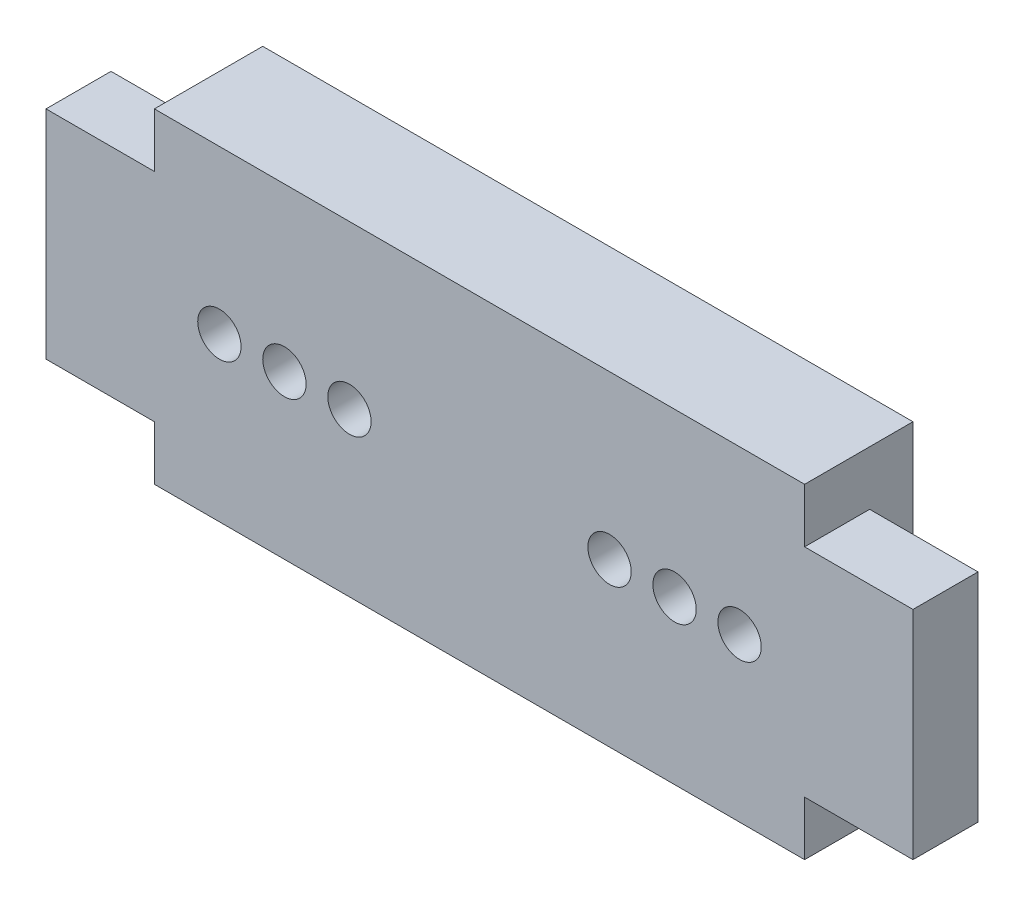
ISO-10303-21;
HEADER;
FILE_DESCRIPTION(('STEP AP214'),'2;1');
FILE_NAME('part.step','',(''),(''),'','','');
FILE_SCHEMA(('AUTOMOTIVE_DESIGN { 1 0 10303 214 1 1 1 1 }'));
ENDSEC;
DATA;
#1=APPLICATION_CONTEXT('core data for automotive mechanical design processes');
#2=APPLICATION_PROTOCOL_DEFINITION('international standard','automotive_design',2000,#1);
#3=PRODUCT_CONTEXT('',#1,'mechanical');
#4=PRODUCT('Part','Part','',(#3));
#5=PRODUCT_RELATED_PRODUCT_CATEGORY('part','',(#4));
#6=PRODUCT_DEFINITION_FORMATION('','',#4);
#7=PRODUCT_DEFINITION_CONTEXT('part definition',#1,'design');
#8=PRODUCT_DEFINITION('design','',#6,#7);
#9=PRODUCT_DEFINITION_SHAPE('','',#8);
#10=(LENGTH_UNIT() NAMED_UNIT(*) SI_UNIT(.MILLI.,.METRE.));
#11=(NAMED_UNIT(*) PLANE_ANGLE_UNIT() SI_UNIT($,.RADIAN.));
#12=(NAMED_UNIT(*) SI_UNIT($,.STERADIAN.) SOLID_ANGLE_UNIT());
#13=UNCERTAINTY_MEASURE_WITH_UNIT(LENGTH_MEASURE(1.E-05),#10,'distance_accuracy_value','');
#14=(GEOMETRIC_REPRESENTATION_CONTEXT(3) GLOBAL_UNCERTAINTY_ASSIGNED_CONTEXT((#13)) GLOBAL_UNIT_ASSIGNED_CONTEXT((#10,
#11,#12)) REPRESENTATION_CONTEXT('',''));
#15=CARTESIAN_POINT('',(0.,0.,0.));
#16=DIRECTION('',(0.,0.,1.));
#17=DIRECTION('',(1.,0.,0.));
#18=AXIS2_PLACEMENT_3D('',#15,#16,#17);
#19=CARTESIAN_POINT('',(-26.8805369127517,15.,0.));
#20=DIRECTION('',(1.,0.,0.));
#21=DIRECTION('',(0.,0.,-1.));
#22=AXIS2_PLACEMENT_3D('',#19,#20,#21);
#23=PLANE('',#22);
#24=DIRECTION('',(0.,0.,1.));
#25=VECTOR('',#24,1.);
#26=CARTESIAN_POINT('',(-26.8805369127517,12.5,-26.7902684563758));
#27=LINE('',#26,#25);
#28=CARTESIAN_POINT('',(-26.8805369127517,12.5,-26.7902684563758));
#29=VERTEX_POINT('',#28);
#30=CARTESIAN_POINT('',(-26.8805369127517,12.5,-23.7902684563758));
#31=VERTEX_POINT('',#30);
#32=EDGE_CURVE('E128',#29,#31,#27,.T.);
#33=ORIENTED_EDGE('',*,*,#32,.F.);
#34=DIRECTION('',(0.,-1.,0.));
#35=VECTOR('',#34,1.);
#36=CARTESIAN_POINT('',(-26.8805369127517,12.5,-26.7902684563758));
#37=LINE('',#36,#35);
#38=CARTESIAN_POINT('',(-26.8805369127517,2.5,-26.7902684563758));
#39=VERTEX_POINT('',#38);
#40=EDGE_CURVE('E153',#29,#39,#37,.T.);
#41=ORIENTED_EDGE('',*,*,#40,.T.);
#42=DIRECTION('',(0.,0.,1.));
#43=VECTOR('',#42,1.);
#44=CARTESIAN_POINT('',(-26.8805369127517,2.5,-26.7902684563758));
#45=LINE('',#44,#43);
#46=CARTESIAN_POINT('',(-26.8805369127517,2.5,-23.7902684563758));
#47=VERTEX_POINT('',#46);
#48=EDGE_CURVE('E314',#39,#47,#45,.T.);
#49=ORIENTED_EDGE('',*,*,#48,.T.);
#50=DIRECTION('',(0.,-1.,0.));
#51=VECTOR('',#50,1.);
#52=CARTESIAN_POINT('',(-26.8805369127517,15.,-23.7902684563758));
#53=LINE('',#52,#51);
#54=CARTESIAN_POINT('',(-26.8805369127517,0.,-23.7902684563758));
#55=VERTEX_POINT('',#54);
#56=EDGE_CURVE('E159',#47,#55,#53,.T.);
#57=ORIENTED_EDGE('',*,*,#56,.T.);
#58=DIRECTION('',(0.,0.,1.));
#59=VECTOR('',#58,1.);
#60=CARTESIAN_POINT('',(-26.8805369127517,0.,0.));
#61=LINE('',#60,#59);
#62=CARTESIAN_POINT('',(-26.8805369127517,0.,-28.7902684563758));
#63=VERTEX_POINT('',#62);
#64=EDGE_CURVE('E193',#63,#55,#61,.T.);
#65=ORIENTED_EDGE('',*,*,#64,.F.);
#66=DIRECTION('',(0.,-1.,0.));
#67=VECTOR('',#66,1.);
#68=CARTESIAN_POINT('',(-26.8805369127517,15.,-28.7902684563758));
#69=LINE('',#68,#67);
#70=CARTESIAN_POINT('',(-26.8805369127517,15.,-28.7902684563758));
#71=VERTEX_POINT('',#70);
#72=EDGE_CURVE('E11',#71,#63,#69,.T.);
#73=ORIENTED_EDGE('',*,*,#72,.F.);
#74=DIRECTION('',(0.,0.,1.));
#75=VECTOR('',#74,1.);
#76=CARTESIAN_POINT('',(-26.8805369127517,15.,0.));
#77=LINE('',#76,#75);
#78=CARTESIAN_POINT('',(-26.8805369127517,15.,-23.7902684563758));
#79=VERTEX_POINT('',#78);
#80=EDGE_CURVE('E156',#71,#79,#77,.T.);
#81=ORIENTED_EDGE('',*,*,#80,.T.);
#82=EDGE_CURVE('E148',#79,#31,#53,.T.);
#83=ORIENTED_EDGE('',*,*,#82,.T.);
#84=EDGE_LOOP('',(#33,#41,#49,#57,#65,#73,#81,#83));
#85=FACE_BOUND('',#84,.T.);
#86=ADVANCED_FACE('F41',(#85),#23,.T.);
#87=CARTESIAN_POINT('',(0.,15.,-28.7902684563758));
#88=DIRECTION('',(0.,0.,-1.));
#89=DIRECTION('',(-1.,0.,0.));
#90=AXIS2_PLACEMENT_3D('',#87,#88,#89);
#91=PLANE('',#90);
#92=CARTESIAN_POINT('',(-41.8805369127517,7.5,-28.7902684563758));
#93=DIRECTION('',(0.,0.,-1.));
#94=DIRECTION('',(-1.,0.,0.));
#95=AXIS2_PLACEMENT_3D('',#92,#93,#94);
#96=CIRCLE('',#95,2.);
#97=CARTESIAN_POINT('',(-43.8805369127517,7.5,-28.7902684563758));
#98=VERTEX_POINT('',#97);
#99=EDGE_CURVE('E260',#98,#98,#96,.T.);
#100=ORIENTED_EDGE('',*,*,#99,.F.);
#101=EDGE_LOOP('',(#100));
#102=FACE_BOUND('',#101,.T.);
#103=CARTESIAN_POINT('',(-32.8805369127517,7.5,-28.7902684563758));
#104=DIRECTION('',(0.,0.,-1.));
#105=DIRECTION('',(-1.,0.,0.));
#106=AXIS2_PLACEMENT_3D('',#103,#104,#105);
#107=CIRCLE('',#106,0.999999999999998);
#108=CARTESIAN_POINT('',(-33.8805369127517,7.5,-28.7902684563758));
#109=VERTEX_POINT('',#108);
#110=EDGE_CURVE('E242',#109,#109,#107,.T.);
#111=ORIENTED_EDGE('',*,*,#110,.F.);
#112=EDGE_LOOP('',(#111));
#113=FACE_BOUND('',#112,.T.);
#114=CARTESIAN_POINT('',(-29.8805369127517,7.5,-28.7902684563758));
#115=DIRECTION('',(0.,0.,-1.));
#116=DIRECTION('',(-1.,0.,0.));
#117=AXIS2_PLACEMENT_3D('',#114,#115,#116);
#118=CIRCLE('',#117,1.);
#119=CARTESIAN_POINT('',(-30.8805369127517,7.5,-28.7902684563758));
#120=VERTEX_POINT('',#119);
#121=EDGE_CURVE('E234',#120,#120,#118,.T.);
#122=ORIENTED_EDGE('',*,*,#121,.F.);
#123=EDGE_LOOP('',(#122));
#124=FACE_BOUND('',#123,.T.);
#125=CARTESIAN_POINT('',(-53.8805369127517,7.5,-28.7902684563758));
#126=DIRECTION('',(0.,0.,-1.));
#127=DIRECTION('',(1.,0.,0.));
#128=AXIS2_PLACEMENT_3D('',#125,#126,#127);
#129=CIRCLE('',#128,0.999999999999998);
#130=CARTESIAN_POINT('',(-52.8805369127517,7.5,-28.7902684563758));
#131=VERTEX_POINT('',#130);
#132=EDGE_CURVE('E224',#131,#131,#129,.T.);
#133=ORIENTED_EDGE('',*,*,#132,.F.);
#134=EDGE_LOOP('',(#133));
#135=FACE_BOUND('',#134,.T.);
#136=CARTESIAN_POINT('',(-50.8805369127517,7.5,-28.7902684563758));
#137=DIRECTION('',(0.,0.,-1.));
#138=DIRECTION('',(1.,0.,0.));
#139=AXIS2_PLACEMENT_3D('',#136,#137,#138);
#140=CIRCLE('',#139,0.999999999999998);
#141=CARTESIAN_POINT('',(-49.8805369127517,7.5,-28.7902684563758));
#142=VERTEX_POINT('',#141);
#143=EDGE_CURVE('E225',#142,#142,#140,.T.);
#144=ORIENTED_EDGE('',*,*,#143,.F.);
#145=EDGE_LOOP('',(#144));
#146=FACE_BOUND('',#145,.T.);
#147=CARTESIAN_POINT('',(-47.8805369127517,7.5,-28.7902684563758));
#148=DIRECTION('',(0.,0.,-1.));
#149=DIRECTION('',(1.,0.,0.));
#150=AXIS2_PLACEMENT_3D('',#147,#148,#149);
#151=CIRCLE('',#150,0.999999999999998);
#152=CARTESIAN_POINT('',(-46.8805369127517,7.5,-28.7902684563758));
#153=VERTEX_POINT('',#152);
#154=EDGE_CURVE('E255',#153,#153,#151,.T.);
#155=ORIENTED_EDGE('',*,*,#154,.F.);
#156=EDGE_LOOP('',(#155));
#157=FACE_BOUND('',#156,.T.);
#158=CARTESIAN_POINT('',(-35.8805369127517,7.5,-28.7902684563758));
#159=DIRECTION('',(0.,0.,-1.));
#160=DIRECTION('',(-1.,0.,0.));
#161=AXIS2_PLACEMENT_3D('',#158,#159,#160);
#162=CIRCLE('',#161,0.999999999999998);
#163=CARTESIAN_POINT('',(-36.8805369127517,7.5,-28.7902684563758));
#164=VERTEX_POINT('',#163);
#165=EDGE_CURVE('E215',#164,#164,#162,.T.);
#166=ORIENTED_EDGE('',*,*,#165,.F.);
#167=EDGE_LOOP('',(#166));
#168=FACE_BOUND('',#167,.T.);
#169=DIRECTION('',(1.,0.,0.));
#170=VECTOR('',#169,1.);
#171=CARTESIAN_POINT('',(0.,0.,-28.7902684563758));
#172=LINE('',#171,#170);
#173=CARTESIAN_POINT('',(-56.8805369127517,0.,-28.7902684563758));
#174=VERTEX_POINT('',#173);
#175=EDGE_CURVE('E187',#174,#63,#172,.T.);
#176=ORIENTED_EDGE('',*,*,#175,.F.);
#177=DIRECTION('',(0.,-1.,0.));
#178=VECTOR('',#177,1.);
#179=CARTESIAN_POINT('',(-56.8805369127517,15.,-28.7902684563758));
#180=LINE('',#179,#178);
#181=CARTESIAN_POINT('',(-56.8805369127517,15.,-28.7902684563758));
#182=VERTEX_POINT('',#181);
#183=EDGE_CURVE('E49',#182,#174,#180,.T.);
#184=ORIENTED_EDGE('',*,*,#183,.F.);
#185=DIRECTION('',(1.,0.,0.));
#186=VECTOR('',#185,1.);
#187=CARTESIAN_POINT('',(0.,15.,-28.7902684563758));
#188=LINE('',#187,#186);
#189=EDGE_CURVE('E207',#182,#71,#188,.T.);
#190=ORIENTED_EDGE('',*,*,#189,.T.);
#191=ORIENTED_EDGE('',*,*,#72,.T.);
#192=EDGE_LOOP('',(#176,#184,#190,#191));
#193=FACE_BOUND('',#192,.T.);
#194=ADVANCED_FACE('F188',(#102,#113,#124,#135,#146,#157,#168,#193),#91,.T.);
#195=CARTESIAN_POINT('',(-56.8805369127517,15.,0.));
#196=DIRECTION('',(-1.,0.,0.));
#197=DIRECTION('',(0.,0.,1.));
#198=AXIS2_PLACEMENT_3D('',#195,#196,#197);
#199=PLANE('',#198);
#200=DIRECTION('',(0.,0.,1.));
#201=VECTOR('',#200,1.);
#202=CARTESIAN_POINT('',(-56.8805369127517,2.5,-26.7902684563758));
#203=LINE('',#202,#201);
#204=CARTESIAN_POINT('',(-56.8805369127517,2.5,-26.7902684563758));
#205=VERTEX_POINT('',#204);
#206=CARTESIAN_POINT('',(-56.8805369127517,2.5,-23.7902684563758));
#207=VERTEX_POINT('',#206);
#208=EDGE_CURVE('E276',#205,#207,#203,.T.);
#209=ORIENTED_EDGE('',*,*,#208,.F.);
#210=DIRECTION('',(0.,-1.,0.));
#211=VECTOR('',#210,1.);
#212=CARTESIAN_POINT('',(-56.8805369127517,12.5,-26.7902684563758));
#213=LINE('',#212,#211);
#214=CARTESIAN_POINT('',(-56.8805369127517,12.5,-26.7902684563758));
#215=VERTEX_POINT('',#214);
#216=EDGE_CURVE('E279',#215,#205,#213,.T.);
#217=ORIENTED_EDGE('',*,*,#216,.F.);
#218=DIRECTION('',(0.,0.,1.));
#219=VECTOR('',#218,1.);
#220=CARTESIAN_POINT('',(-56.8805369127517,12.5,-26.7902684563758));
#221=LINE('',#220,#219);
#222=CARTESIAN_POINT('',(-56.8805369127517,12.5,-23.7902684563758));
#223=VERTEX_POINT('',#222);
#224=EDGE_CURVE('E273',#215,#223,#221,.T.);
#225=ORIENTED_EDGE('',*,*,#224,.T.);
#226=DIRECTION('',(0.,-1.,0.));
#227=VECTOR('',#226,1.);
#228=CARTESIAN_POINT('',(-56.8805369127517,15.,-23.7902684563758));
#229=LINE('',#228,#227);
#230=CARTESIAN_POINT('',(-56.8805369127517,15.,-23.7902684563758));
#231=VERTEX_POINT('',#230);
#232=EDGE_CURVE('E163',#231,#223,#229,.T.);
#233=ORIENTED_EDGE('',*,*,#232,.F.);
#234=DIRECTION('',(0.,0.,-1.));
#235=VECTOR('',#234,1.);
#236=CARTESIAN_POINT('',(-56.8805369127517,15.,0.));
#237=LINE('',#236,#235);
#238=EDGE_CURVE('E182',#231,#182,#237,.T.);
#239=ORIENTED_EDGE('',*,*,#238,.T.);
#240=ORIENTED_EDGE('',*,*,#183,.T.);
#241=DIRECTION('',(0.,0.,-1.));
#242=VECTOR('',#241,1.);
#243=CARTESIAN_POINT('',(-56.8805369127517,0.,0.));
#244=LINE('',#243,#242);
#245=CARTESIAN_POINT('',(-56.8805369127517,0.,-23.7902684563758));
#246=VERTEX_POINT('',#245);
#247=EDGE_CURVE('E180',#246,#174,#244,.T.);
#248=ORIENTED_EDGE('',*,*,#247,.F.);
#249=EDGE_CURVE('E158',#207,#246,#229,.T.);
#250=ORIENTED_EDGE('',*,*,#249,.F.);
#251=EDGE_LOOP('',(#209,#217,#225,#233,#239,#240,#248,#250));
#252=FACE_BOUND('',#251,.T.);
#253=ADVANCED_FACE('F177',(#252),#199,.T.);
#254=CARTESIAN_POINT('',(0.,15.,-23.7902684563758));
#255=DIRECTION('',(0.,0.,-1.));
#256=DIRECTION('',(-1.,0.,0.));
#257=AXIS2_PLACEMENT_3D('',#254,#255,#256);
#258=PLANE('',#257);
#259=CARTESIAN_POINT('',(-32.8805369127517,7.5,-23.7902684563758));
#260=DIRECTION('',(0.,0.,-1.));
#261=DIRECTION('',(-1.,0.,0.));
#262=AXIS2_PLACEMENT_3D('',#259,#260,#261);
#263=CIRCLE('',#262,0.999999999999998);
#264=CARTESIAN_POINT('',(-33.8805369127517,7.5,-23.7902684563758));
#265=VERTEX_POINT('',#264);
#266=EDGE_CURVE('E219',#265,#265,#263,.F.);
#267=ORIENTED_EDGE('',*,*,#266,.F.);
#268=EDGE_LOOP('',(#267));
#269=FACE_BOUND('',#268,.T.);
#270=CARTESIAN_POINT('',(-29.8805369127517,7.5,-23.7902684563758));
#271=DIRECTION('',(0.,0.,-1.));
#272=DIRECTION('',(-1.,0.,0.));
#273=AXIS2_PLACEMENT_3D('',#270,#271,#272);
#274=CIRCLE('',#273,1.);
#275=CARTESIAN_POINT('',(-30.8805369127517,7.5,-23.7902684563758));
#276=VERTEX_POINT('',#275);
#277=EDGE_CURVE('E238',#276,#276,#274,.F.);
#278=ORIENTED_EDGE('',*,*,#277,.F.);
#279=EDGE_LOOP('',(#278));
#280=FACE_BOUND('',#279,.T.);
#281=CARTESIAN_POINT('',(-53.8805369127517,7.5,-23.7902684563758));
#282=DIRECTION('',(0.,0.,-1.));
#283=DIRECTION('',(-1.,0.,0.));
#284=AXIS2_PLACEMENT_3D('',#281,#282,#283);
#285=CIRCLE('',#284,0.999999999999998);
#286=CARTESIAN_POINT('',(-54.8805369127517,7.5,-23.7902684563758));
#287=VERTEX_POINT('',#286);
#288=EDGE_CURVE('E230',#287,#287,#285,.F.);
#289=ORIENTED_EDGE('',*,*,#288,.F.);
#290=EDGE_LOOP('',(#289));
#291=FACE_BOUND('',#290,.T.);
#292=CARTESIAN_POINT('',(-50.8805369127517,7.5,-23.7902684563758));
#293=DIRECTION('',(0.,0.,-1.));
#294=DIRECTION('',(-1.,0.,0.));
#295=AXIS2_PLACEMENT_3D('',#292,#293,#294);
#296=CIRCLE('',#295,0.999999999999998);
#297=CARTESIAN_POINT('',(-51.8805369127517,7.5,-23.7902684563758));
#298=VERTEX_POINT('',#297);
#299=EDGE_CURVE('E220',#298,#298,#296,.F.);
#300=ORIENTED_EDGE('',*,*,#299,.F.);
#301=EDGE_LOOP('',(#300));
#302=FACE_BOUND('',#301,.T.);
#303=CARTESIAN_POINT('',(-47.8805369127517,7.5,-23.7902684563758));
#304=DIRECTION('',(0.,0.,-1.));
#305=DIRECTION('',(-1.,0.,0.));
#306=AXIS2_PLACEMENT_3D('',#303,#304,#305);
#307=CIRCLE('',#306,0.999999999999998);
#308=CARTESIAN_POINT('',(-48.8805369127517,7.5,-23.7902684563758));
#309=VERTEX_POINT('',#308);
#310=EDGE_CURVE('E229',#309,#309,#307,.F.);
#311=ORIENTED_EDGE('',*,*,#310,.F.);
#312=EDGE_LOOP('',(#311));
#313=FACE_BOUND('',#312,.T.);
#314=CARTESIAN_POINT('',(-35.8805369127517,7.5,-23.7902684563758));
#315=DIRECTION('',(0.,0.,-1.));
#316=DIRECTION('',(-1.,0.,0.));
#317=AXIS2_PLACEMENT_3D('',#314,#315,#316);
#318=CIRCLE('',#317,0.999999999999998);
#319=CARTESIAN_POINT('',(-36.8805369127517,7.5,-23.7902684563758));
#320=VERTEX_POINT('',#319);
#321=EDGE_CURVE('E202',#320,#320,#318,.F.);
#322=ORIENTED_EDGE('',*,*,#321,.F.);
#323=EDGE_LOOP('',(#322));
#324=FACE_BOUND('',#323,.T.);
#325=DIRECTION('',(1.,0.,0.));
#326=VECTOR('',#325,1.);
#327=CARTESIAN_POINT('',(0.,0.,-23.7902684563758));
#328=LINE('',#327,#326);
#329=EDGE_CURVE('E167',#246,#55,#328,.T.);
#330=ORIENTED_EDGE('',*,*,#329,.T.);
#331=ORIENTED_EDGE('',*,*,#56,.F.);
#332=DIRECTION('',(1.,0.,0.));
#333=VECTOR('',#332,1.);
#334=CARTESIAN_POINT('',(-26.8805369127517,2.5,-23.7902684563758));
#335=LINE('',#334,#333);
#336=CARTESIAN_POINT('',(-21.8805369127517,2.50000000000001,-23.7902684563758));
#337=VERTEX_POINT('',#336);
#338=EDGE_CURVE('E56',#47,#337,#335,.T.);
#339=ORIENTED_EDGE('',*,*,#338,.T.);
#340=DIRECTION('',(0.,-1.,0.));
#341=VECTOR('',#340,1.);
#342=CARTESIAN_POINT('',(-21.8805369127517,12.5,-23.7902684563758));
#343=LINE('',#342,#341);
#344=CARTESIAN_POINT('',(-21.8805369127517,12.5,-23.7902684563758));
#345=VERTEX_POINT('',#344);
#346=EDGE_CURVE('E151',#345,#337,#343,.T.);
#347=ORIENTED_EDGE('',*,*,#346,.F.);
#348=DIRECTION('',(1.,0.,0.));
#349=VECTOR('',#348,1.);
#350=CARTESIAN_POINT('',(-26.8805369127517,12.5,-23.7902684563758));
#351=LINE('',#350,#349);
#352=EDGE_CURVE('E132',#31,#345,#351,.T.);
#353=ORIENTED_EDGE('',*,*,#352,.F.);
#354=ORIENTED_EDGE('',*,*,#82,.F.);
#355=DIRECTION('',(1.,0.,0.));
#356=VECTOR('',#355,1.);
#357=CARTESIAN_POINT('',(0.,15.,-23.7902684563758));
#358=LINE('',#357,#356);
#359=EDGE_CURVE('E165',#231,#79,#358,.T.);
#360=ORIENTED_EDGE('',*,*,#359,.F.);
#361=ORIENTED_EDGE('',*,*,#232,.T.);
#362=DIRECTION('',(-1.,0.,0.));
#363=VECTOR('',#362,1.);
#364=CARTESIAN_POINT('',(-56.8805369127517,12.5,-23.7902684563758));
#365=LINE('',#364,#363);
#366=CARTESIAN_POINT('',(-61.8805369127517,12.5,-23.7902684563758));
#367=VERTEX_POINT('',#366);
#368=EDGE_CURVE('E64',#223,#367,#365,.T.);
#369=ORIENTED_EDGE('',*,*,#368,.T.);
#370=DIRECTION('',(0.,-1.,0.));
#371=VECTOR('',#370,1.);
#372=CARTESIAN_POINT('',(-61.8805369127517,12.5,-23.7902684563758));
#373=LINE('',#372,#371);
#374=CARTESIAN_POINT('',(-61.8805369127517,2.5,-23.7902684563758));
#375=VERTEX_POINT('',#374);
#376=EDGE_CURVE('E283',#367,#375,#373,.T.);
#377=ORIENTED_EDGE('',*,*,#376,.T.);
#378=DIRECTION('',(-1.,0.,0.));
#379=VECTOR('',#378,1.);
#380=CARTESIAN_POINT('',(-56.8805369127517,2.5,-23.7902684563758));
#381=LINE('',#380,#379);
#382=EDGE_CURVE('E287',#207,#375,#381,.T.);
#383=ORIENTED_EDGE('',*,*,#382,.F.);
#384=ORIENTED_EDGE('',*,*,#249,.T.);
#385=EDGE_LOOP('',(#330,#331,#339,#347,#353,#354,#360,#361,#369,#377,#383,#384));
#386=FACE_BOUND('',#385,.T.);
#387=ADVANCED_FACE('F146',(#269,#280,#291,#302,#313,#324,#386),#258,.F.);
#388=CARTESIAN_POINT('',(0.,15.,0.));
#389=DIRECTION('',(0.,1.,0.));
#390=DIRECTION('',(0.,0.,1.));
#391=AXIS2_PLACEMENT_3D('',#388,#389,#390);
#392=PLANE('',#391);
#393=ORIENTED_EDGE('',*,*,#80,.F.);
#394=ORIENTED_EDGE('',*,*,#189,.F.);
#395=ORIENTED_EDGE('',*,*,#238,.F.);
#396=ORIENTED_EDGE('',*,*,#359,.T.);
#397=EDGE_LOOP('',(#393,#394,#395,#396));
#398=FACE_BOUND('',#397,.T.);
#399=ADVANCED_FACE('F329',(#398),#392,.T.);
#400=CARTESIAN_POINT('',(0.,0.,0.));
#401=DIRECTION('',(0.,1.,0.));
#402=DIRECTION('',(0.,0.,1.));
#403=AXIS2_PLACEMENT_3D('',#400,#401,#402);
#404=PLANE('',#403);
#405=ORIENTED_EDGE('',*,*,#64,.T.);
#406=ORIENTED_EDGE('',*,*,#329,.F.);
#407=ORIENTED_EDGE('',*,*,#247,.T.);
#408=ORIENTED_EDGE('',*,*,#175,.T.);
#409=EDGE_LOOP('',(#405,#406,#407,#408));
#410=FACE_BOUND('',#409,.T.);
#411=ADVANCED_FACE('F196',(#410),#404,.F.);
#412=CARTESIAN_POINT('',(-35.8805369127517,7.5,-20.9618413316296));
#413=DIRECTION('',(0.,0.,-1.));
#414=DIRECTION('',(-1.,0.,0.));
#415=AXIS2_PLACEMENT_3D('',#412,#413,#414);
#416=CYLINDRICAL_SURFACE('',#415,0.999999999999998);
#417=ORIENTED_EDGE('',*,*,#321,.T.);
#418=EDGE_LOOP('',(#417));
#419=FACE_BOUND('',#418,.T.);
#420=ORIENTED_EDGE('',*,*,#165,.T.);
#421=EDGE_LOOP('',(#420));
#422=FACE_BOUND('',#421,.T.);
#423=ADVANCED_FACE('F371',(#419,#422),#416,.F.);
#424=CARTESIAN_POINT('',(-47.8805369127517,7.5,-20.9618413316296));
#425=DIRECTION('',(0.,0.,-1.));
#426=DIRECTION('',(-1.,0.,0.));
#427=AXIS2_PLACEMENT_3D('',#424,#425,#426);
#428=CYLINDRICAL_SURFACE('',#427,0.999999999999998);
#429=ORIENTED_EDGE('',*,*,#310,.T.);
#430=EDGE_LOOP('',(#429));
#431=FACE_BOUND('',#430,.T.);
#432=ORIENTED_EDGE('',*,*,#154,.T.);
#433=EDGE_LOOP('',(#432));
#434=FACE_BOUND('',#433,.T.);
#435=ADVANCED_FACE('F376',(#431,#434),#428,.F.);
#436=CARTESIAN_POINT('',(-50.8805369127517,7.5,-20.9618413316296));
#437=DIRECTION('',(0.,0.,-1.));
#438=DIRECTION('',(-1.,0.,0.));
#439=AXIS2_PLACEMENT_3D('',#436,#437,#438);
#440=CYLINDRICAL_SURFACE('',#439,0.999999999999998);
#441=ORIENTED_EDGE('',*,*,#299,.T.);
#442=EDGE_LOOP('',(#441));
#443=FACE_BOUND('',#442,.T.);
#444=ORIENTED_EDGE('',*,*,#143,.T.);
#445=EDGE_LOOP('',(#444));
#446=FACE_BOUND('',#445,.T.);
#447=ADVANCED_FACE('F378',(#443,#446),#440,.F.);
#448=CARTESIAN_POINT('',(-53.8805369127517,7.5,-20.9618413316296));
#449=DIRECTION('',(0.,0.,-1.));
#450=DIRECTION('',(-1.,0.,0.));
#451=AXIS2_PLACEMENT_3D('',#448,#449,#450);
#452=CYLINDRICAL_SURFACE('',#451,0.999999999999998);
#453=ORIENTED_EDGE('',*,*,#288,.T.);
#454=EDGE_LOOP('',(#453));
#455=FACE_BOUND('',#454,.T.);
#456=ORIENTED_EDGE('',*,*,#132,.T.);
#457=EDGE_LOOP('',(#456));
#458=FACE_BOUND('',#457,.T.);
#459=ADVANCED_FACE('F381',(#455,#458),#452,.F.);
#460=CARTESIAN_POINT('',(-29.8805369127517,7.5,-20.9618413316296));
#461=DIRECTION('',(0.,0.,-1.));
#462=DIRECTION('',(-1.,0.,0.));
#463=AXIS2_PLACEMENT_3D('',#460,#461,#462);
#464=CYLINDRICAL_SURFACE('',#463,1.);
#465=ORIENTED_EDGE('',*,*,#277,.T.);
#466=EDGE_LOOP('',(#465));
#467=FACE_BOUND('',#466,.T.);
#468=ORIENTED_EDGE('',*,*,#121,.T.);
#469=EDGE_LOOP('',(#468));
#470=FACE_BOUND('',#469,.T.);
#471=ADVANCED_FACE('F385',(#467,#470),#464,.F.);
#472=CARTESIAN_POINT('',(-32.8805369127517,7.5,-20.9618413316296));
#473=DIRECTION('',(0.,0.,-1.));
#474=DIRECTION('',(-1.,0.,0.));
#475=AXIS2_PLACEMENT_3D('',#472,#473,#474);
#476=CYLINDRICAL_SURFACE('',#475,0.999999999999998);
#477=ORIENTED_EDGE('',*,*,#266,.T.);
#478=EDGE_LOOP('',(#477));
#479=FACE_BOUND('',#478,.T.);
#480=ORIENTED_EDGE('',*,*,#110,.T.);
#481=EDGE_LOOP('',(#480));
#482=FACE_BOUND('',#481,.T.);
#483=ADVANCED_FACE('F389',(#479,#482),#476,.F.);
#484=CARTESIAN_POINT('',(-41.8805369127517,7.5,-27.2902684563758));
#485=DIRECTION('',(0.,0.,-1.));
#486=DIRECTION('',(-1.,0.,0.));
#487=AXIS2_PLACEMENT_3D('',#484,#485,#486);
#488=CYLINDRICAL_SURFACE('',#487,2.);
#489=CARTESIAN_POINT('',(-41.8805369127517,7.5,-27.2902684563758));
#490=DIRECTION('',(0.,0.,-1.));
#491=DIRECTION('',(-1.,0.,0.));
#492=AXIS2_PLACEMENT_3D('',#489,#490,#491);
#493=CIRCLE('',#492,2.);
#494=CARTESIAN_POINT('',(-43.8805369127517,7.5,-27.2902684563758));
#495=VERTEX_POINT('',#494);
#496=EDGE_CURVE('E259',#495,#495,#493,.T.);
#497=ORIENTED_EDGE('',*,*,#496,.F.);
#498=EDGE_LOOP('',(#497));
#499=FACE_BOUND('',#498,.T.);
#500=ORIENTED_EDGE('',*,*,#99,.T.);
#501=EDGE_LOOP('',(#500));
#502=FACE_BOUND('',#501,.T.);
#503=ADVANCED_FACE('F351',(#499,#502),#488,.F.);
#504=CARTESIAN_POINT('',(-41.8805369127517,7.5,-27.2902684563758));
#505=DIRECTION('',(0.,0.,-1.));
#506=DIRECTION('',(-1.,0.,0.));
#507=AXIS2_PLACEMENT_3D('',#504,#505,#506);
#508=PLANE('',#507);
#509=ORIENTED_EDGE('',*,*,#496,.T.);
#510=EDGE_LOOP('',(#509));
#511=FACE_BOUND('',#510,.T.);
#512=ADVANCED_FACE('F344',(#511),#508,.T.);
#513=CARTESIAN_POINT('',(-56.8805369127517,2.5,-26.7902684563758));
#514=DIRECTION('',(0.,1.,0.));
#515=DIRECTION('',(0.,0.,1.));
#516=AXIS2_PLACEMENT_3D('',#513,#514,#515);
#517=PLANE('',#516);
#518=ORIENTED_EDGE('',*,*,#382,.T.);
#519=DIRECTION('',(0.,0.,1.));
#520=VECTOR('',#519,1.);
#521=CARTESIAN_POINT('',(-61.8805369127517,2.5,-26.7902684563758));
#522=LINE('',#521,#520);
#523=CARTESIAN_POINT('',(-61.8805369127517,2.5,-26.7902684563758));
#524=VERTEX_POINT('',#523);
#525=EDGE_CURVE('E264',#524,#375,#522,.T.);
#526=ORIENTED_EDGE('',*,*,#525,.F.);
#527=DIRECTION('',(-1.,0.,0.));
#528=VECTOR('',#527,1.);
#529=CARTESIAN_POINT('',(-56.8805369127517,2.5,-26.7902684563758));
#530=LINE('',#529,#528);
#531=EDGE_CURVE('E282',#205,#524,#530,.T.);
#532=ORIENTED_EDGE('',*,*,#531,.F.);
#533=ORIENTED_EDGE('',*,*,#208,.T.);
#534=EDGE_LOOP('',(#518,#526,#532,#533));
#535=FACE_BOUND('',#534,.T.);
#536=ADVANCED_FACE('F342',(#535),#517,.F.);
#537=CARTESIAN_POINT('',(-61.8805369127517,12.5,-26.7902684563758));
#538=DIRECTION('',(-1.,0.,0.));
#539=DIRECTION('',(0.,0.,1.));
#540=AXIS2_PLACEMENT_3D('',#537,#538,#539);
#541=PLANE('',#540);
#542=ORIENTED_EDGE('',*,*,#376,.F.);
#543=DIRECTION('',(0.,0.,1.));
#544=VECTOR('',#543,1.);
#545=CARTESIAN_POINT('',(-61.8805369127517,12.5,-26.7902684563758));
#546=LINE('',#545,#544);
#547=CARTESIAN_POINT('',(-61.8805369127517,12.5,-26.7902684563758));
#548=VERTEX_POINT('',#547);
#549=EDGE_CURVE('E270',#548,#367,#546,.T.);
#550=ORIENTED_EDGE('',*,*,#549,.F.);
#551=DIRECTION('',(0.,-1.,0.));
#552=VECTOR('',#551,1.);
#553=CARTESIAN_POINT('',(-61.8805369127517,12.5,-26.7902684563758));
#554=LINE('',#553,#552);
#555=EDGE_CURVE('E297',#548,#524,#554,.T.);
#556=ORIENTED_EDGE('',*,*,#555,.T.);
#557=ORIENTED_EDGE('',*,*,#525,.T.);
#558=EDGE_LOOP('',(#542,#550,#556,#557));
#559=FACE_BOUND('',#558,.T.);
#560=ADVANCED_FACE('F340',(#559),#541,.T.);
#561=CARTESIAN_POINT('',(-56.8805369127517,12.5,-26.7902684563758));
#562=DIRECTION('',(0.,1.,0.));
#563=DIRECTION('',(0.,0.,1.));
#564=AXIS2_PLACEMENT_3D('',#561,#562,#563);
#565=PLANE('',#564);
#566=ORIENTED_EDGE('',*,*,#368,.F.);
#567=ORIENTED_EDGE('',*,*,#224,.F.);
#568=DIRECTION('',(-1.,0.,0.));
#569=VECTOR('',#568,1.);
#570=CARTESIAN_POINT('',(-56.8805369127517,12.5,-26.7902684563758));
#571=LINE('',#570,#569);
#572=EDGE_CURVE('E293',#215,#548,#571,.T.);
#573=ORIENTED_EDGE('',*,*,#572,.T.);
#574=ORIENTED_EDGE('',*,*,#549,.T.);
#575=EDGE_LOOP('',(#566,#567,#573,#574));
#576=FACE_BOUND('',#575,.T.);
#577=ADVANCED_FACE('F332',(#576),#565,.T.);
#578=CARTESIAN_POINT('',(0.,0.,-26.7902684563758));
#579=DIRECTION('',(0.,0.,1.));
#580=DIRECTION('',(1.,0.,0.));
#581=AXIS2_PLACEMENT_3D('',#578,#579,#580);
#582=PLANE('',#581);
#583=ORIENTED_EDGE('',*,*,#531,.T.);
#584=ORIENTED_EDGE('',*,*,#555,.F.);
#585=ORIENTED_EDGE('',*,*,#572,.F.);
#586=ORIENTED_EDGE('',*,*,#216,.T.);
#587=EDGE_LOOP('',(#583,#584,#585,#586));
#588=FACE_BOUND('',#587,.T.);
#589=ADVANCED_FACE('F335',(#588),#582,.F.);
#590=CARTESIAN_POINT('',(-26.8805369127517,12.5,-26.7902684563758));
#591=DIRECTION('',(0.,-1.,0.));
#592=DIRECTION('',(1.,0.,0.));
#593=AXIS2_PLACEMENT_3D('',#590,#591,#592);
#594=PLANE('',#593);
#595=ORIENTED_EDGE('',*,*,#352,.T.);
#596=DIRECTION('',(0.,0.,1.));
#597=VECTOR('',#596,1.);
#598=CARTESIAN_POINT('',(-21.8805369127517,12.5,-26.7902684563758));
#599=LINE('',#598,#597);
#600=CARTESIAN_POINT('',(-21.8805369127517,12.5,-26.7902684563758));
#601=VERTEX_POINT('',#600);
#602=EDGE_CURVE('E140',#601,#345,#599,.T.);
#603=ORIENTED_EDGE('',*,*,#602,.F.);
#604=DIRECTION('',(1.,0.,0.));
#605=VECTOR('',#604,1.);
#606=CARTESIAN_POINT('',(-26.8805369127517,12.5,-26.7902684563758));
#607=LINE('',#606,#605);
#608=EDGE_CURVE('E134',#29,#601,#607,.T.);
#609=ORIENTED_EDGE('',*,*,#608,.F.);
#610=ORIENTED_EDGE('',*,*,#32,.T.);
#611=EDGE_LOOP('',(#595,#603,#609,#610));
#612=FACE_BOUND('',#611,.T.);
#613=ADVANCED_FACE('F130',(#612),#594,.F.);
#614=CARTESIAN_POINT('',(-21.8805369127517,12.5,-26.7902684563758));
#615=DIRECTION('',(-1.,0.,0.));
#616=DIRECTION('',(0.,0.,1.));
#617=AXIS2_PLACEMENT_3D('',#614,#615,#616);
#618=PLANE('',#617);
#619=ORIENTED_EDGE('',*,*,#346,.T.);
#620=DIRECTION('',(0.,0.,1.));
#621=VECTOR('',#620,1.);
#622=CARTESIAN_POINT('',(-21.8805369127517,2.50000000000001,-26.7902684563758));
#623=LINE('',#622,#621);
#624=CARTESIAN_POINT('',(-21.8805369127517,2.50000000000001,-26.7902684563758));
#625=VERTEX_POINT('',#624);
#626=EDGE_CURVE('E321',#625,#337,#623,.T.);
#627=ORIENTED_EDGE('',*,*,#626,.F.);
#628=DIRECTION('',(0.,-1.,0.));
#629=VECTOR('',#628,1.);
#630=CARTESIAN_POINT('',(-21.8805369127517,12.5,-26.7902684563758));
#631=LINE('',#630,#629);
#632=EDGE_CURVE('E309',#601,#625,#631,.T.);
#633=ORIENTED_EDGE('',*,*,#632,.F.);
#634=ORIENTED_EDGE('',*,*,#602,.T.);
#635=EDGE_LOOP('',(#619,#627,#633,#634));
#636=FACE_BOUND('',#635,.T.);
#637=ADVANCED_FACE('F465',(#636),#618,.F.);
#638=CARTESIAN_POINT('',(-26.8805369127517,2.5,-26.7902684563758));
#639=DIRECTION('',(0.,-1.,0.));
#640=DIRECTION('',(1.,0.,0.));
#641=AXIS2_PLACEMENT_3D('',#638,#639,#640);
#642=PLANE('',#641);
#643=ORIENTED_EDGE('',*,*,#338,.F.);
#644=ORIENTED_EDGE('',*,*,#48,.F.);
#645=DIRECTION('',(1.,0.,0.));
#646=VECTOR('',#645,1.);
#647=CARTESIAN_POINT('',(-26.8805369127517,2.5,-26.7902684563758));
#648=LINE('',#647,#646);
#649=EDGE_CURVE('E305',#39,#625,#648,.T.);
#650=ORIENTED_EDGE('',*,*,#649,.T.);
#651=ORIENTED_EDGE('',*,*,#626,.T.);
#652=EDGE_LOOP('',(#643,#644,#650,#651));
#653=FACE_BOUND('',#652,.T.);
#654=ADVANCED_FACE('F474',(#653),#642,.T.);
#655=CARTESIAN_POINT('',(0.,0.,-26.7902684563758));
#656=DIRECTION('',(0.,0.,1.));
#657=DIRECTION('',(1.,0.,0.));
#658=AXIS2_PLACEMENT_3D('',#655,#656,#657);
#659=PLANE('',#658);
#660=ORIENTED_EDGE('',*,*,#40,.F.);
#661=ORIENTED_EDGE('',*,*,#608,.T.);
#662=ORIENTED_EDGE('',*,*,#632,.T.);
#663=ORIENTED_EDGE('',*,*,#649,.F.);
#664=EDGE_LOOP('',(#660,#661,#662,#663));
#665=FACE_BOUND('',#664,.T.);
#666=ADVANCED_FACE('F484',(#665),#659,.F.);
#667=CLOSED_SHELL('',(#86,#194,#253,#387,#399,#411,#423,#435,#447,#459,#471,#483,#503,#512,#536,
#560,#577,#589,#613,#637,#654,#666));
#668=MANIFOLD_SOLID_BREP('B2',#667);
#669=ADVANCED_BREP_SHAPE_REPRESENTATION('',(#18,#668),#14);
#670=SHAPE_DEFINITION_REPRESENTATION(#9,#669);
ENDSEC;
END-ISO-10303-21;
